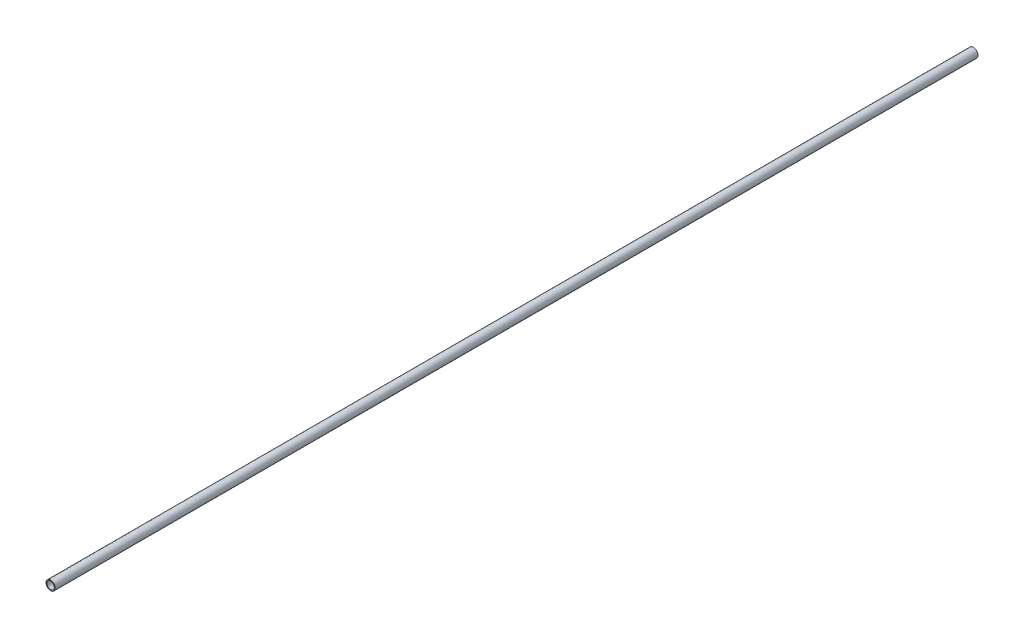
ISO-10303-21;
HEADER;
FILE_DESCRIPTION(('STEP AP214'),'2;1');
FILE_NAME('part.step','',(''),(''),'','','');
FILE_SCHEMA(('AUTOMOTIVE_DESIGN { 1 0 10303 214 1 1 1 1 }'));
ENDSEC;
DATA;
#1=APPLICATION_CONTEXT('core data for automotive mechanical design processes');
#2=APPLICATION_PROTOCOL_DEFINITION('international standard','automotive_design',2000,#1);
#3=PRODUCT_CONTEXT('',#1,'mechanical');
#4=PRODUCT('Part','Part','',(#3));
#5=PRODUCT_RELATED_PRODUCT_CATEGORY('part','',(#4));
#6=PRODUCT_DEFINITION_FORMATION('','',#4);
#7=PRODUCT_DEFINITION_CONTEXT('part definition',#1,'design');
#8=PRODUCT_DEFINITION('design','',#6,#7);
#9=PRODUCT_DEFINITION_SHAPE('','',#8);
#10=(LENGTH_UNIT() NAMED_UNIT(*) SI_UNIT(.MILLI.,.METRE.));
#11=(NAMED_UNIT(*) PLANE_ANGLE_UNIT() SI_UNIT($,.RADIAN.));
#12=(NAMED_UNIT(*) SI_UNIT($,.STERADIAN.) SOLID_ANGLE_UNIT());
#13=UNCERTAINTY_MEASURE_WITH_UNIT(LENGTH_MEASURE(1.E-05),#10,'distance_accuracy_value','');
#14=(GEOMETRIC_REPRESENTATION_CONTEXT(3) GLOBAL_UNCERTAINTY_ASSIGNED_CONTEXT((#13)) GLOBAL_UNIT_ASSIGNED_CONTEXT((#10,
#11,#12)) REPRESENTATION_CONTEXT('',''));
#15=CARTESIAN_POINT('',(0.,0.,0.));
#16=DIRECTION('',(0.,0.,1.));
#17=DIRECTION('',(1.,0.,0.));
#18=AXIS2_PLACEMENT_3D('',#15,#16,#17);
#19=CARTESIAN_POINT('',(0.,0.,2000.));
#20=DIRECTION('',(0.,0.,-1.));
#21=DIRECTION('',(-1.,0.,0.));
#22=AXIS2_PLACEMENT_3D('',#19,#20,#21);
#23=CYLINDRICAL_SURFACE('',#22,10.);
#24=CARTESIAN_POINT('',(0.,0.,2000.));
#25=DIRECTION('',(0.,0.,1.));
#26=DIRECTION('',(1.,0.,0.));
#27=AXIS2_PLACEMENT_3D('',#24,#25,#26);
#28=CIRCLE('',#27,10.);
#29=CARTESIAN_POINT('',(10.,0.,2000.));
#30=VERTEX_POINT('',#29);
#31=EDGE_CURVE('E10',#30,#30,#28,.T.);
#32=ORIENTED_EDGE('',*,*,#31,.F.);
#33=EDGE_LOOP('',(#32));
#34=FACE_BOUND('',#33,.T.);
#35=CARTESIAN_POINT('',(0.,0.,0.));
#36=DIRECTION('',(0.,0.,1.));
#37=DIRECTION('',(1.,0.,0.));
#38=AXIS2_PLACEMENT_3D('',#35,#36,#37);
#39=CIRCLE('',#38,10.);
#40=CARTESIAN_POINT('',(10.,0.,0.));
#41=VERTEX_POINT('',#40);
#42=EDGE_CURVE('E40',#41,#41,#39,.T.);
#43=ORIENTED_EDGE('',*,*,#42,.T.);
#44=EDGE_LOOP('',(#43));
#45=FACE_BOUND('',#44,.T.);
#46=ADVANCED_FACE('F37',(#34,#45),#23,.T.);
#47=CARTESIAN_POINT('',(0.,0.,2000.));
#48=DIRECTION('',(0.,0.,1.));
#49=DIRECTION('',(1.,0.,0.));
#50=AXIS2_PLACEMENT_3D('',#47,#48,#49);
#51=PLANE('',#50);
#52=CARTESIAN_POINT('',(0.,0.,2000.));
#53=DIRECTION('',(0.,0.,1.));
#54=DIRECTION('',(1.,0.,0.));
#55=AXIS2_PLACEMENT_3D('',#52,#53,#54);
#56=CIRCLE('',#55,8.);
#57=CARTESIAN_POINT('',(8.,0.,2000.));
#58=VERTEX_POINT('',#57);
#59=EDGE_CURVE('E51',#58,#58,#56,.T.);
#60=ORIENTED_EDGE('',*,*,#59,.F.);
#61=EDGE_LOOP('',(#60));
#62=FACE_BOUND('',#61,.T.);
#63=ORIENTED_EDGE('',*,*,#31,.T.);
#64=EDGE_LOOP('',(#63));
#65=FACE_BOUND('',#64,.T.);
#66=ADVANCED_FACE('F68',(#62,#65),#51,.T.);
#67=CARTESIAN_POINT('',(0.,0.,0.));
#68=DIRECTION('',(0.,0.,1.));
#69=DIRECTION('',(1.,0.,0.));
#70=AXIS2_PLACEMENT_3D('',#67,#68,#69);
#71=PLANE('',#70);
#72=CARTESIAN_POINT('',(0.,0.,0.));
#73=DIRECTION('',(0.,0.,1.));
#74=DIRECTION('',(1.,0.,0.));
#75=AXIS2_PLACEMENT_3D('',#72,#73,#74);
#76=CIRCLE('',#75,8.);
#77=CARTESIAN_POINT('',(8.,0.,0.));
#78=VERTEX_POINT('',#77);
#79=EDGE_CURVE('E49',#78,#78,#76,.T.);
#80=ORIENTED_EDGE('',*,*,#79,.T.);
#81=EDGE_LOOP('',(#80));
#82=FACE_BOUND('',#81,.T.);
#83=ORIENTED_EDGE('',*,*,#42,.F.);
#84=EDGE_LOOP('',(#83));
#85=FACE_BOUND('',#84,.T.);
#86=ADVANCED_FACE('F59',(#82,#85),#71,.F.);
#87=CARTESIAN_POINT('',(0.,0.,0.));
#88=DIRECTION('',(0.,0.,1.));
#89=DIRECTION('',(1.,0.,0.));
#90=AXIS2_PLACEMENT_3D('',#87,#88,#89);
#91=CYLINDRICAL_SURFACE('',#90,8.);
#92=ORIENTED_EDGE('',*,*,#79,.F.);
#93=EDGE_LOOP('',(#92));
#94=FACE_BOUND('',#93,.T.);
#95=ORIENTED_EDGE('',*,*,#59,.T.);
#96=EDGE_LOOP('',(#95));
#97=FACE_BOUND('',#96,.T.);
#98=ADVANCED_FACE('F62',(#94,#97),#91,.F.);
#99=CLOSED_SHELL('',(#46,#66,#86,#98));
#100=MANIFOLD_SOLID_BREP('B2',#99);
#101=ADVANCED_BREP_SHAPE_REPRESENTATION('',(#18,#100),#14);
#102=SHAPE_DEFINITION_REPRESENTATION(#9,#101);
ENDSEC;
END-ISO-10303-21;
